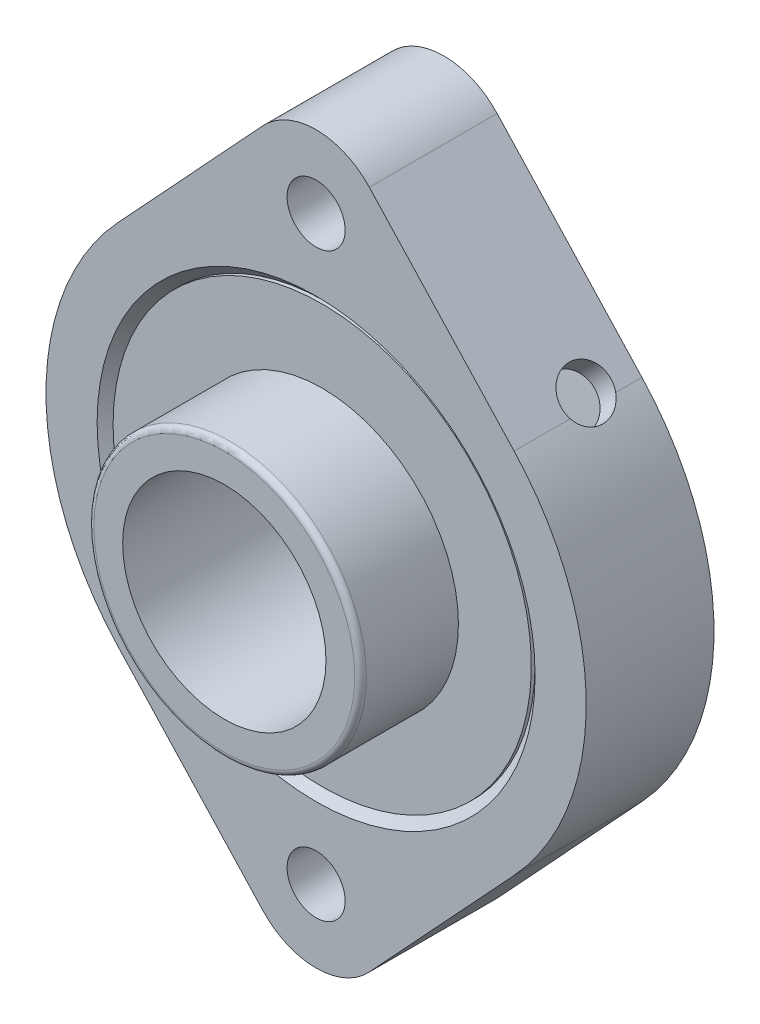
ISO-10303-21;
HEADER;
FILE_DESCRIPTION(('STEP AP214'),'2;1');
FILE_NAME('part.step','',(''),(''),'','','');
FILE_SCHEMA(('AUTOMOTIVE_DESIGN { 1 0 10303 214 1 1 1 1 }'));
ENDSEC;
DATA;
#1=APPLICATION_CONTEXT('core data for automotive mechanical design processes');
#2=APPLICATION_PROTOCOL_DEFINITION('international standard','automotive_design',2000,#1);
#3=PRODUCT_CONTEXT('',#1,'mechanical');
#4=PRODUCT('Part','Part','',(#3));
#5=PRODUCT_RELATED_PRODUCT_CATEGORY('part','',(#4));
#6=PRODUCT_DEFINITION_FORMATION('','',#4);
#7=PRODUCT_DEFINITION_CONTEXT('part definition',#1,'design');
#8=PRODUCT_DEFINITION('design','',#6,#7);
#9=PRODUCT_DEFINITION_SHAPE('','',#8);
#10=(LENGTH_UNIT() NAMED_UNIT(*) SI_UNIT(.MILLI.,.METRE.));
#11=(NAMED_UNIT(*) PLANE_ANGLE_UNIT() SI_UNIT($,.RADIAN.));
#12=(NAMED_UNIT(*) SI_UNIT($,.STERADIAN.) SOLID_ANGLE_UNIT());
#13=UNCERTAINTY_MEASURE_WITH_UNIT(LENGTH_MEASURE(1.E-05),#10,'distance_accuracy_value','');
#14=(GEOMETRIC_REPRESENTATION_CONTEXT(3) GLOBAL_UNCERTAINTY_ASSIGNED_CONTEXT((#13)) GLOBAL_UNIT_ASSIGNED_CONTEXT((#10,
#11,#12)) REPRESENTATION_CONTEXT('',''));
#15=CARTESIAN_POINT('',(0.,0.,0.));
#16=DIRECTION('',(0.,0.,1.));
#17=DIRECTION('',(1.,0.,0.));
#18=AXIS2_PLACEMENT_3D('',#15,#16,#17);
#19=CARTESIAN_POINT('',(0.,0.,0.));
#20=DIRECTION('',(0.,0.,-1.));
#21=DIRECTION('',(-1.,0.,0.));
#22=AXIS2_PLACEMENT_3D('',#19,#20,#21);
#23=CYLINDRICAL_SURFACE('',#22,36.);
#24=CARTESIAN_POINT('',(0.,0.,1.7));
#25=DIRECTION('',(0.,0.,-1.));
#26=DIRECTION('',(-1.,0.,0.));
#27=AXIS2_PLACEMENT_3D('',#24,#25,#26);
#28=CIRCLE('',#27,36.);
#29=CARTESIAN_POINT('',(-36.,0.,1.7));
#30=VERTEX_POINT('',#29);
#31=EDGE_CURVE('E172',#30,#30,#28,.T.);
#32=ORIENTED_EDGE('',*,*,#31,.T.);
#33=EDGE_LOOP('',(#32));
#34=FACE_BOUND('',#33,.T.);
#35=CARTESIAN_POINT('',(0.,0.,3.95));
#36=DIRECTION('',(0.,0.,1.));
#37=DIRECTION('',(1.,0.,0.));
#38=AXIS2_PLACEMENT_3D('',#35,#36,#37);
#39=CIRCLE('',#38,36.);
#40=CARTESIAN_POINT('',(36.,0.,3.95));
#41=VERTEX_POINT('',#40);
#42=EDGE_CURVE('E10',#41,#41,#39,.F.);
#43=ORIENTED_EDGE('',*,*,#42,.F.);
#44=EDGE_LOOP('',(#43));
#45=FACE_BOUND('',#44,.T.);
#46=ADVANCED_FACE('F15',(#34,#45),#23,.F.);
#47=CARTESIAN_POINT('',(-9.16515138991167,-58.5,22.));
#48=DIRECTION('',(-0.733212111192934,-0.68,0.));
#49=DIRECTION('',(0.68,-0.733212111192934,0.));
#50=AXIS2_PLACEMENT_3D('',#47,#48,#49);
#51=PLANE('',#50);
#52=DIRECTION('',(-0.68,0.733212111192934,0.));
#53=VECTOR('',#52,1.);
#54=CARTESIAN_POINT('',(-9.16515138991167,-58.5,0.));
#55=LINE('',#54,#53);
#56=CARTESIAN_POINT('',(-9.16515138991168,-58.5,0.));
#57=VERTEX_POINT('',#56);
#58=CARTESIAN_POINT('',(-34.0943631704714,-31.62,0.));
#59=VERTEX_POINT('',#58);
#60=EDGE_CURVE('E100',#57,#59,#55,.T.);
#61=ORIENTED_EDGE('',*,*,#60,.F.);
#62=DIRECTION('',(0.,0.,-1.));
#63=VECTOR('',#62,1.);
#64=CARTESIAN_POINT('',(-9.16515138991168,-58.5,22.));
#65=LINE('',#64,#63);
#66=CARTESIAN_POINT('',(-9.16515138991168,-58.5,22.));
#67=VERTEX_POINT('',#66);
#68=EDGE_CURVE('E38',#67,#57,#65,.T.);
#69=ORIENTED_EDGE('',*,*,#68,.F.);
#70=DIRECTION('',(-0.68,0.733212111192934,0.));
#71=VECTOR('',#70,1.);
#72=CARTESIAN_POINT('',(-9.16515138991167,-58.5,22.));
#73=LINE('',#72,#71);
#74=CARTESIAN_POINT('',(-34.0943631704714,-31.62,22.));
#75=VERTEX_POINT('',#74);
#76=EDGE_CURVE('E242',#67,#75,#73,.T.);
#77=ORIENTED_EDGE('',*,*,#76,.T.);
#78=DIRECTION('',(0.,0.,-1.));
#79=VECTOR('',#78,1.);
#80=CARTESIAN_POINT('',(-34.0943631704714,-31.62,22.));
#81=LINE('',#80,#79);
#82=EDGE_CURVE('E127',#75,#59,#81,.T.);
#83=ORIENTED_EDGE('',*,*,#82,.T.);
#84=EDGE_LOOP('',(#61,#69,#77,#83));
#85=FACE_BOUND('',#84,.T.);
#86=ADVANCED_FACE('F17',(#85),#51,.T.);
#87=CARTESIAN_POINT('',(0.,-50.,22.));
#88=DIRECTION('',(0.,0.,-1.));
#89=DIRECTION('',(-1.,0.,0.));
#90=AXIS2_PLACEMENT_3D('',#87,#88,#89);
#91=CYLINDRICAL_SURFACE('',#90,12.5);
#92=CARTESIAN_POINT('',(0.,-50.,0.));
#93=DIRECTION('',(0.,0.,1.));
#94=DIRECTION('',(1.,0.,0.));
#95=AXIS2_PLACEMENT_3D('',#92,#93,#94);
#96=CIRCLE('',#95,12.5);
#97=CARTESIAN_POINT('',(9.16515138991168,-58.5,0.));
#98=VERTEX_POINT('',#97);
#99=EDGE_CURVE('E248',#57,#98,#96,.T.);
#100=ORIENTED_EDGE('',*,*,#99,.T.);
#101=DIRECTION('',(0.,0.,-1.));
#102=VECTOR('',#101,1.);
#103=CARTESIAN_POINT('',(9.16515138991168,-58.5,22.));
#104=LINE('',#103,#102);
#105=CARTESIAN_POINT('',(9.16515138991168,-58.5,22.));
#106=VERTEX_POINT('',#105);
#107=EDGE_CURVE('E114',#106,#98,#104,.T.);
#108=ORIENTED_EDGE('',*,*,#107,.F.);
#109=CARTESIAN_POINT('',(0.,-50.,22.));
#110=DIRECTION('',(0.,0.,1.));
#111=DIRECTION('',(1.,0.,0.));
#112=AXIS2_PLACEMENT_3D('',#109,#110,#111);
#113=CIRCLE('',#112,12.5);
#114=EDGE_CURVE('E130',#67,#106,#113,.T.);
#115=ORIENTED_EDGE('',*,*,#114,.F.);
#116=ORIENTED_EDGE('',*,*,#68,.T.);
#117=EDGE_LOOP('',(#100,#108,#115,#116));
#118=FACE_BOUND('',#117,.T.);
#119=ADVANCED_FACE('F207',(#118),#91,.T.);
#120=CARTESIAN_POINT('',(9.16515138991168,-58.5,22.));
#121=DIRECTION('',(-0.733212111192935,0.68,0.));
#122=DIRECTION('',(-0.68,-0.733212111192935,0.));
#123=AXIS2_PLACEMENT_3D('',#120,#121,#122);
#124=PLANE('',#123);
#125=DIRECTION('',(0.68,0.733212111192934,0.));
#126=VECTOR('',#125,1.);
#127=CARTESIAN_POINT('',(9.16515138991168,-58.5,0.));
#128=LINE('',#127,#126);
#129=CARTESIAN_POINT('',(34.0943631704714,-31.62,0.));
#130=VERTEX_POINT('',#129);
#131=EDGE_CURVE('E256',#98,#130,#128,.T.);
#132=ORIENTED_EDGE('',*,*,#131,.T.);
#133=DIRECTION('',(0.,0.,-1.));
#134=VECTOR('',#133,1.);
#135=CARTESIAN_POINT('',(34.0943631704714,-31.62,22.));
#136=LINE('',#135,#134);
#137=CARTESIAN_POINT('',(34.0943631704714,-31.62,22.));
#138=VERTEX_POINT('',#137);
#139=EDGE_CURVE('E107',#138,#130,#136,.T.);
#140=ORIENTED_EDGE('',*,*,#139,.F.);
#141=DIRECTION('',(0.68,0.733212111192934,0.));
#142=VECTOR('',#141,1.);
#143=CARTESIAN_POINT('',(9.16515138991168,-58.5,22.));
#144=LINE('',#143,#142);
#145=EDGE_CURVE('E268',#106,#138,#144,.T.);
#146=ORIENTED_EDGE('',*,*,#145,.F.);
#147=ORIENTED_EDGE('',*,*,#107,.T.);
#148=EDGE_LOOP('',(#132,#140,#146,#147));
#149=FACE_BOUND('',#148,.T.);
#150=ADVANCED_FACE('F209',(#149),#124,.F.);
#151=CARTESIAN_POINT('',(0.,0.,22.));
#152=DIRECTION('',(0.,0.,-1.));
#153=DIRECTION('',(-1.,0.,0.));
#154=AXIS2_PLACEMENT_3D('',#151,#152,#153);
#155=CYLINDRICAL_SURFACE('',#154,46.5);
#156=DIRECTION('',(0.,0.,-1.));
#157=VECTOR('',#156,1.);
#158=CARTESIAN_POINT('',(34.0943631704714,31.62,22.));
#159=LINE('',#158,#157);
#160=CARTESIAN_POINT('',(34.0943631704714,31.62,4.52087109975289));
#161=VERTEX_POINT('',#160);
#162=CARTESIAN_POINT('',(34.0943631704714,31.62,0.));
#163=VERTEX_POINT('',#162);
#164=EDGE_CURVE('E98',#161,#163,#159,.T.);
#165=ORIENTED_EDGE('',*,*,#164,.F.);
#166=CARTESIAN_POINT('',(35.7692309983765,29.7121543107326,8.4302));
#167=CARTESIAN_POINT('',(35.7692254561079,29.7121635364158,8.67022988429306));
#168=CARTESIAN_POINT('',(35.756249114742,29.7278041995873,8.91042081029502));
#169=CARTESIAN_POINT('',(35.7045674556961,29.7898544820454,9.38415004010265));
#170=CARTESIAN_POINT('',(35.6658333872455,29.8362984838606,9.61768060549834));
#171=CARTESIAN_POINT('',(35.5634424470962,29.9582686954238,10.0711597834122));
#172=CARTESIAN_POINT('',(35.4998001981988,30.0337778415211,10.2911162772863));
#173=CARTESIAN_POINT('',(35.3489271749272,30.2112039382318,10.7113418697394));
#174=CARTESIAN_POINT('',(35.2617012627528,30.313115445339,10.9116150148058));
#175=CARTESIAN_POINT('',(35.0652272779965,30.5401763458986,11.2874608311464));
#176=CARTESIAN_POINT('',(34.9559191226329,30.6653890638803,11.4629638441586));
#177=CARTESIAN_POINT('',(34.7178297537534,30.9346816954479,11.7836883299502));
#178=CARTESIAN_POINT('',(34.5890476698315,31.0787624523205,11.9289084485157));
#179=CARTESIAN_POINT('',(34.3147388229442,31.3813704875181,12.1851816894636));
#180=CARTESIAN_POINT('',(34.1691827709278,31.5399229313651,12.2961737654083));
#181=CARTESIAN_POINT('',(33.8650819809425,31.8662188822345,12.4804497682124));
#182=CARTESIAN_POINT('',(33.7065375153133,32.0339621965192,12.5537344854816));
#183=CARTESIAN_POINT('',(33.3810558904335,32.3729847241378,12.6603128428896));
#184=CARTESIAN_POINT('',(33.2141440083465,32.5442524637337,12.6937201611715));
#185=CARTESIAN_POINT('',(32.8760920442889,32.8857154294857,12.7199469911473));
#186=CARTESIAN_POINT('',(32.7049520566661,33.0559106794677,12.712767407704));
#187=CARTESIAN_POINT('',(32.3638927614773,33.3898975738291,12.6581168538885));
#188=CARTESIAN_POINT('',(32.1939713260559,33.5537070707237,12.6107681234561));
#189=CARTESIAN_POINT('',(31.8598875599316,33.8710892717323,12.4773135872285));
#190=CARTESIAN_POINT('',(31.6957252942355,34.0246618603146,12.3912073441087));
#191=CARTESIAN_POINT('',(31.3779777318752,34.3179162798177,12.1825468970022));
#192=CARTESIAN_POINT('',(31.224408651216,34.4575769534556,12.0599382763226));
#193=CARTESIAN_POINT('',(30.9329941545703,34.7194226668504,11.7817929922067));
#194=CARTESIAN_POINT('',(30.7951491293804,34.8416072722864,11.6262555106497));
#195=CARTESIAN_POINT('',(30.5392125814562,35.0661610687445,11.2859794307008));
#196=CARTESIAN_POINT('',(30.421196303469,35.1684550010399,11.1011345533857));
#197=CARTESIAN_POINT('',(30.2095412660357,35.3504336872525,10.7078601689583));
#198=CARTESIAN_POINT('',(30.1159025337662,35.4301184159647,10.4994306355537));
#199=CARTESIAN_POINT('',(29.9562532199488,35.5652060999507,10.06482520629));
#200=CARTESIAN_POINT('',(29.8902471940019,35.620605051478,9.83864639153018));
#201=CARTESIAN_POINT('',(29.7882501402077,35.7059464985723,9.37500083147789));
#202=CARTESIAN_POINT('',(29.7522583390535,35.73588965,9.1375343771744));
#203=CARTESIAN_POINT('',(29.7116739040213,35.7696399410706,8.65898710525928));
#204=CARTESIAN_POINT('',(29.7069665455948,35.7735425752451,8.41792274636374));
#205=CARTESIAN_POINT('',(29.7288176935448,35.755385502723,7.93820347211821));
#206=CARTESIAN_POINT('',(29.7553758425265,35.7333260927975,7.69954852925774));
#207=CARTESIAN_POINT('',(29.8387179817599,35.6637605521811,7.23185266055563));
#208=CARTESIAN_POINT('',(29.8954483542485,35.6162995606092,7.00279545551552));
#209=CARTESIAN_POINT('',(30.0370801467671,35.4969342819518,6.56029199744237));
#210=CARTESIAN_POINT('',(30.1219821167365,35.4250295176971,6.34684604925689));
#211=CARTESIAN_POINT('',(30.3172872206761,35.2580287193141,5.94094517977125));
#212=CARTESIAN_POINT('',(30.4277634904814,35.1628661294879,5.74855283552523));
#213=CARTESIAN_POINT('',(30.6703243705633,34.9514951652063,5.39085400900537));
#214=CARTESIAN_POINT('',(30.8024094346317,34.8352863487677,5.2255480957016));
#215=CARTESIAN_POINT('',(31.084253347763,34.584026306798,4.92620453947198));
#216=CARTESIAN_POINT('',(31.2340648060356,34.4489187650994,4.79226367411646));
#217=CARTESIAN_POINT('',(31.5461922238308,34.1633201379182,4.56011729849237));
#218=CARTESIAN_POINT('',(31.7085080347847,34.0128292352039,4.46191136372366));
#219=CARTESIAN_POINT('',(32.0402878095187,33.7004709993624,4.30418764049512));
#220=CARTESIAN_POINT('',(32.2097404209524,33.5386214797435,4.24461070978115));
#221=CARTESIAN_POINT('',(32.5508751230014,33.2076344030564,4.16564300612893));
#222=CARTESIAN_POINT('',(32.7225571610239,33.0384970176936,4.14625128693686));
#223=CARTESIAN_POINT('',(33.0624967571763,32.6983015181016,4.14821662779184));
#224=CARTESIAN_POINT('',(33.2307646366299,32.5272528276434,4.16942316256173));
#225=CARTESIAN_POINT('',(33.5598640184205,32.1875980480688,4.25166825761926));
#226=CARTESIAN_POINT('',(33.7206955126485,32.018991961616,4.31270686134001));
#227=CARTESIAN_POINT('',(34.0306851310267,31.6893310493359,4.47284338839639));
#228=CARTESIAN_POINT('',(34.179844353012,31.5282755139143,4.57193772720945));
#229=CARTESIAN_POINT('',(34.4628189335305,31.2187146685365,4.80535627829713));
#230=CARTESIAN_POINT('',(34.5966344572458,31.0702092234774,4.93968011125898));
#231=CARTESIAN_POINT('',(34.846251027484,30.7900013844369,5.24030990170125));
#232=CARTESIAN_POINT('',(34.9619864382644,30.6583605108856,5.40672769953473));
#233=CARTESIAN_POINT('',(35.1723138513329,30.4168384075728,5.76660827998015));
#234=CARTESIAN_POINT('',(35.2669007507198,30.3069624301673,5.96007757155351));
#235=CARTESIAN_POINT('',(35.4330481122509,30.1125479211409,6.36902588271521));
#236=CARTESIAN_POINT('',(35.5045572960921,30.0280658425107,6.584552533823));
#237=CARTESIAN_POINT('',(35.6226979805273,29.8878215048551,7.03100990551552));
#238=CARTESIAN_POINT('',(35.669357811654,29.8320265424169,7.26192274490153));
#239=CARTESIAN_POINT('',(35.7251159391823,29.7652010525927,7.65017559157857));
#240=CARTESIAN_POINT('',(35.74164233762,29.7453408919306,7.80502580440075));
#241=CARTESIAN_POINT('',(35.7637016588979,29.7188145298277,8.11662776895285));
#242=CARTESIAN_POINT('',(35.7692346193475,29.7121482832492,8.27337951417562));
#243=CARTESIAN_POINT('',(35.7692309983765,29.7121543107326,8.4302));
#244=B_SPLINE_CURVE_WITH_KNOTS('',3,(#166,#167,#168,#169,#170,#171,#172,#173,#174,#175,#176,
#177,#178,#179,#180,#181,#182,#183,#184,#185,#186,#187,#188,#189,#190,#191,#192,#193,#194,#195,
#196,#197,#198,#199,#200,#201,#202,#203,#204,#205,#206,#207,#208,#209,#210,#211,#212,#213,#214,
#215,#216,#217,#218,#219,#220,#221,#222,#223,#224,#225,#226,#227,#228,#229,#230,#231,#232,#233,
#234,#235,#236,#237,#238,#239,#240,#241,#242,#243),.UNSPECIFIED.,.T.,.F.,(4,2,2,2,2,2,2,2,2,2,2,
2,2,2,2,2,2,2,2,2,2,2,2,2,2,2,2,2,2,2,2,2,2,2,2,2,2,2,4),(0.,0.71951702240366,1.43983852067846,
2.1597377738859,2.87948871983472,3.60122504471728,4.32299363784314,5.04604217329137,
5.76907555180482,6.49004282530659,7.21099402529976,7.92975911442344,8.64853231401428,
9.36838245175172,10.0882504763351,10.8107913573822,11.5333330439276,12.2559938037388,
12.9786359438535,13.6986265820805,14.4186089902052,15.137316202623,15.856037445793,
16.5768400057162,17.297657704678,18.0206710297903,18.743675765848,19.4655709279932,
20.1874490912528,20.9066559450098,21.6258635829951,22.3450034944222,23.0641356632528,
23.7858206731112,24.5076796300884,25.2311316755116,25.9537571441574,26.4238460889792,
26.8939334255813),.UNSPECIFIED.);
#245=CARTESIAN_POINT('',(34.0943631704714,31.62,12.3395289002471));
#246=VERTEX_POINT('',#245);
#247=EDGE_CURVE('E30',#161,#246,#244,.T.);
#248=ORIENTED_EDGE('',*,*,#247,.T.);
#249=CARTESIAN_POINT('',(34.0943631704714,31.62,22.));
#250=VERTEX_POINT('',#249);
#251=EDGE_CURVE('E95',#250,#246,#159,.T.);
#252=ORIENTED_EDGE('',*,*,#251,.F.);
#253=CARTESIAN_POINT('',(0.,0.,22.));
#254=DIRECTION('',(0.,0.,1.));
#255=DIRECTION('',(1.,0.,0.));
#256=AXIS2_PLACEMENT_3D('',#253,#254,#255);
#257=CIRCLE('',#256,46.5);
#258=EDGE_CURVE('E293',#138,#250,#257,.T.);
#259=ORIENTED_EDGE('',*,*,#258,.F.);
#260=ORIENTED_EDGE('',*,*,#139,.T.);
#261=CARTESIAN_POINT('',(0.,0.,0.));
#262=DIRECTION('',(0.,0.,1.));
#263=DIRECTION('',(1.,0.,0.));
#264=AXIS2_PLACEMENT_3D('',#261,#262,#263);
#265=CIRCLE('',#264,46.5);
#266=EDGE_CURVE('E274',#130,#163,#265,.T.);
#267=ORIENTED_EDGE('',*,*,#266,.T.);
#268=EDGE_LOOP('',(#165,#248,#252,#259,#260,#267));
#269=FACE_BOUND('',#268,.T.);
#270=ADVANCED_FACE('F93',(#269),#155,.T.);
#271=CARTESIAN_POINT('',(9.16515138991168,58.5,22.));
#272=DIRECTION('',(0.733212111192935,0.68,0.));
#273=DIRECTION('',(-0.68,0.733212111192935,0.));
#274=AXIS2_PLACEMENT_3D('',#271,#272,#273);
#275=PLANE('',#274);
#276=CARTESIAN_POINT('',(32.9037655647799,32.9037655647799,8.4302));
#277=DIRECTION('',(0.733212111192935,0.68,0.));
#278=DIRECTION('',(-0.68,0.733212111192935,0.));
#279=AXIS2_PLACEMENT_3D('',#276,#277,#278);
#280=ELLIPSE('',#279,4.28603508254045,4.283);
#281=EDGE_CURVE('E24',#161,#246,#280,.T.);
#282=ORIENTED_EDGE('',*,*,#281,.F.);
#283=ORIENTED_EDGE('',*,*,#164,.T.);
#284=DIRECTION('',(0.68,-0.733212111192934,0.));
#285=VECTOR('',#284,1.);
#286=CARTESIAN_POINT('',(9.16515138991168,58.5,0.));
#287=LINE('',#286,#285);
#288=CARTESIAN_POINT('',(9.16515138991169,58.5,0.));
#289=VERTEX_POINT('',#288);
#290=EDGE_CURVE('E280',#289,#163,#287,.T.);
#291=ORIENTED_EDGE('',*,*,#290,.F.);
#292=DIRECTION('',(0.,0.,-1.));
#293=VECTOR('',#292,1.);
#294=CARTESIAN_POINT('',(9.16515138991169,58.5,22.));
#295=LINE('',#294,#293);
#296=CARTESIAN_POINT('',(9.16515138991169,58.5,22.));
#297=VERTEX_POINT('',#296);
#298=EDGE_CURVE('E117',#297,#289,#295,.T.);
#299=ORIENTED_EDGE('',*,*,#298,.F.);
#300=DIRECTION('',(0.68,-0.733212111192934,0.));
#301=VECTOR('',#300,1.);
#302=CARTESIAN_POINT('',(9.16515138991168,58.5,22.));
#303=LINE('',#302,#301);
#304=EDGE_CURVE('E105',#297,#250,#303,.T.);
#305=ORIENTED_EDGE('',*,*,#304,.T.);
#306=ORIENTED_EDGE('',*,*,#251,.T.);
#307=EDGE_LOOP('',(#282,#283,#291,#299,#305,#306));
#308=FACE_BOUND('',#307,.T.);
#309=ADVANCED_FACE('F103',(#308),#275,.T.);
#310=CARTESIAN_POINT('',(0.,50.,22.));
#311=DIRECTION('',(0.,0.,-1.));
#312=DIRECTION('',(-1.,0.,0.));
#313=AXIS2_PLACEMENT_3D('',#310,#311,#312);
#314=CYLINDRICAL_SURFACE('',#313,12.5);
#315=CARTESIAN_POINT('',(0.,50.,0.));
#316=DIRECTION('',(0.,0.,1.));
#317=DIRECTION('',(1.,0.,0.));
#318=AXIS2_PLACEMENT_3D('',#315,#316,#317);
#319=CIRCLE('',#318,12.5);
#320=CARTESIAN_POINT('',(-9.16515138991167,58.5,0.));
#321=VERTEX_POINT('',#320);
#322=EDGE_CURVE('E635',#289,#321,#319,.T.);
#323=ORIENTED_EDGE('',*,*,#322,.T.);
#324=DIRECTION('',(0.,0.,-1.));
#325=VECTOR('',#324,1.);
#326=CARTESIAN_POINT('',(-9.16515138991167,58.5,22.));
#327=LINE('',#326,#325);
#328=CARTESIAN_POINT('',(-9.16515138991167,58.5,22.));
#329=VERTEX_POINT('',#328);
#330=EDGE_CURVE('E122',#329,#321,#327,.T.);
#331=ORIENTED_EDGE('',*,*,#330,.F.);
#332=CARTESIAN_POINT('',(0.,50.,22.));
#333=DIRECTION('',(0.,0.,1.));
#334=DIRECTION('',(1.,0.,0.));
#335=AXIS2_PLACEMENT_3D('',#332,#333,#334);
#336=CIRCLE('',#335,12.5);
#337=EDGE_CURVE('E288',#297,#329,#336,.T.);
#338=ORIENTED_EDGE('',*,*,#337,.F.);
#339=ORIENTED_EDGE('',*,*,#298,.T.);
#340=EDGE_LOOP('',(#323,#331,#338,#339));
#341=FACE_BOUND('',#340,.T.);
#342=ADVANCED_FACE('F328',(#341),#314,.T.);
#343=CARTESIAN_POINT('',(-9.16515138991167,58.5,22.));
#344=DIRECTION('',(0.733212111192934,-0.68,0.));
#345=DIRECTION('',(0.68,0.733212111192934,0.));
#346=AXIS2_PLACEMENT_3D('',#343,#344,#345);
#347=PLANE('',#346);
#348=DIRECTION('',(-0.68,-0.733212111192934,0.));
#349=VECTOR('',#348,1.);
#350=CARTESIAN_POINT('',(-9.16515138991167,58.5,0.));
#351=LINE('',#350,#349);
#352=CARTESIAN_POINT('',(-34.0943631704714,31.62,0.));
#353=VERTEX_POINT('',#352);
#354=EDGE_CURVE('E633',#321,#353,#351,.T.);
#355=ORIENTED_EDGE('',*,*,#354,.T.);
#356=DIRECTION('',(0.,0.,-1.));
#357=VECTOR('',#356,1.);
#358=CARTESIAN_POINT('',(-34.0943631704714,31.62,22.));
#359=LINE('',#358,#357);
#360=CARTESIAN_POINT('',(-34.0943631704714,31.62,22.));
#361=VERTEX_POINT('',#360);
#362=EDGE_CURVE('E126',#361,#353,#359,.T.);
#363=ORIENTED_EDGE('',*,*,#362,.F.);
#364=DIRECTION('',(-0.68,-0.733212111192934,0.));
#365=VECTOR('',#364,1.);
#366=CARTESIAN_POINT('',(-9.16515138991167,58.5,22.));
#367=LINE('',#366,#365);
#368=EDGE_CURVE('E253',#329,#361,#367,.T.);
#369=ORIENTED_EDGE('',*,*,#368,.F.);
#370=ORIENTED_EDGE('',*,*,#330,.T.);
#371=EDGE_LOOP('',(#355,#363,#369,#370));
#372=FACE_BOUND('',#371,.T.);
#373=ADVANCED_FACE('F337',(#372),#347,.F.);
#374=CARTESIAN_POINT('',(0.,0.,22.));
#375=DIRECTION('',(0.,0.,-1.));
#376=DIRECTION('',(-1.,0.,0.));
#377=AXIS2_PLACEMENT_3D('',#374,#375,#376);
#378=CYLINDRICAL_SURFACE('',#377,46.5);
#379=CARTESIAN_POINT('',(0.,0.,0.));
#380=DIRECTION('',(0.,0.,1.));
#381=DIRECTION('',(1.,0.,0.));
#382=AXIS2_PLACEMENT_3D('',#379,#380,#381);
#383=CIRCLE('',#382,46.5);
#384=EDGE_CURVE('E187',#353,#59,#383,.T.);
#385=ORIENTED_EDGE('',*,*,#384,.T.);
#386=ORIENTED_EDGE('',*,*,#82,.F.);
#387=CARTESIAN_POINT('',(0.,0.,22.));
#388=DIRECTION('',(0.,0.,1.));
#389=DIRECTION('',(1.,0.,0.));
#390=AXIS2_PLACEMENT_3D('',#387,#388,#389);
#391=CIRCLE('',#390,46.5);
#392=EDGE_CURVE('E245',#361,#75,#391,.T.);
#393=ORIENTED_EDGE('',*,*,#392,.F.);
#394=ORIENTED_EDGE('',*,*,#362,.T.);
#395=EDGE_LOOP('',(#385,#386,#393,#394));
#396=FACE_BOUND('',#395,.T.);
#397=ADVANCED_FACE('F205',(#396),#378,.T.);
#398=CARTESIAN_POINT('',(0.,0.,22.));
#399=DIRECTION('',(0.,0.,1.));
#400=DIRECTION('',(1.,0.,0.));
#401=AXIS2_PLACEMENT_3D('',#398,#399,#400);
#402=PLANE('',#401);
#403=CARTESIAN_POINT('',(0.,-50.,22.));
#404=DIRECTION('',(0.,0.,1.));
#405=DIRECTION('',(1.,0.,0.));
#406=AXIS2_PLACEMENT_3D('',#403,#404,#405);
#407=CIRCLE('',#406,5.);
#408=CARTESIAN_POINT('',(4.99999999999999,-50.,22.));
#409=VERTEX_POINT('',#408);
#410=EDGE_CURVE('E138',#409,#409,#407,.T.);
#411=ORIENTED_EDGE('',*,*,#410,.F.);
#412=EDGE_LOOP('',(#411));
#413=FACE_BOUND('',#412,.T.);
#414=CARTESIAN_POINT('',(0.,50.,22.));
#415=DIRECTION('',(0.,0.,1.));
#416=DIRECTION('',(1.,0.,0.));
#417=AXIS2_PLACEMENT_3D('',#414,#415,#416);
#418=CIRCLE('',#417,5.);
#419=CARTESIAN_POINT('',(5.,50.,22.));
#420=VERTEX_POINT('',#419);
#421=EDGE_CURVE('E137',#420,#420,#418,.T.);
#422=ORIENTED_EDGE('',*,*,#421,.F.);
#423=EDGE_LOOP('',(#422));
#424=FACE_BOUND('',#423,.T.);
#425=CARTESIAN_POINT('',(0.,0.,22.));
#426=DIRECTION('',(0.,0.,-1.));
#427=DIRECTION('',(-1.,0.,0.));
#428=AXIS2_PLACEMENT_3D('',#425,#426,#427);
#429=CIRCLE('',#428,37.7);
#430=CARTESIAN_POINT('',(-37.7,0.,22.));
#431=VERTEX_POINT('',#430);
#432=EDGE_CURVE('E176',#431,#431,#429,.T.);
#433=ORIENTED_EDGE('',*,*,#432,.T.);
#434=EDGE_LOOP('',(#433));
#435=FACE_BOUND('',#434,.T.);
#436=ORIENTED_EDGE('',*,*,#76,.F.);
#437=ORIENTED_EDGE('',*,*,#114,.T.);
#438=ORIENTED_EDGE('',*,*,#145,.T.);
#439=ORIENTED_EDGE('',*,*,#258,.T.);
#440=ORIENTED_EDGE('',*,*,#304,.F.);
#441=ORIENTED_EDGE('',*,*,#337,.T.);
#442=ORIENTED_EDGE('',*,*,#368,.T.);
#443=ORIENTED_EDGE('',*,*,#392,.T.);
#444=EDGE_LOOP('',(#436,#437,#438,#439,#440,#441,#442,#443));
#445=FACE_BOUND('',#444,.T.);
#446=ADVANCED_FACE('F202',(#413,#424,#435,#445),#402,.T.);
#447=CARTESIAN_POINT('',(0.,0.,0.));
#448=DIRECTION('',(0.,0.,1.));
#449=DIRECTION('',(1.,0.,0.));
#450=AXIS2_PLACEMENT_3D('',#447,#448,#449);
#451=PLANE('',#450);
#452=CARTESIAN_POINT('',(0.,-50.,0.));
#453=DIRECTION('',(0.,0.,1.));
#454=DIRECTION('',(1.,0.,0.));
#455=AXIS2_PLACEMENT_3D('',#452,#453,#454);
#456=CIRCLE('',#455,5.);
#457=CARTESIAN_POINT('',(4.99999999999999,-50.,0.));
#458=VERTEX_POINT('',#457);
#459=EDGE_CURVE('E139',#458,#458,#456,.T.);
#460=ORIENTED_EDGE('',*,*,#459,.T.);
#461=EDGE_LOOP('',(#460));
#462=FACE_BOUND('',#461,.T.);
#463=CARTESIAN_POINT('',(0.,50.,0.));
#464=DIRECTION('',(0.,0.,1.));
#465=DIRECTION('',(1.,0.,0.));
#466=AXIS2_PLACEMENT_3D('',#463,#464,#465);
#467=CIRCLE('',#466,5.);
#468=CARTESIAN_POINT('',(5.,50.,0.));
#469=VERTEX_POINT('',#468);
#470=EDGE_CURVE('E134',#469,#469,#467,.T.);
#471=ORIENTED_EDGE('',*,*,#470,.T.);
#472=EDGE_LOOP('',(#471));
#473=FACE_BOUND('',#472,.T.);
#474=CARTESIAN_POINT('',(0.,0.,0.));
#475=DIRECTION('',(0.,0.,-1.));
#476=DIRECTION('',(-1.,0.,0.));
#477=AXIS2_PLACEMENT_3D('',#474,#475,#476);
#478=CIRCLE('',#477,37.7);
#479=CARTESIAN_POINT('',(-37.7,0.,0.));
#480=VERTEX_POINT('',#479);
#481=EDGE_CURVE('E168',#480,#480,#478,.T.);
#482=ORIENTED_EDGE('',*,*,#481,.F.);
#483=EDGE_LOOP('',(#482));
#484=FACE_BOUND('',#483,.T.);
#485=ORIENTED_EDGE('',*,*,#60,.T.);
#486=ORIENTED_EDGE('',*,*,#384,.F.);
#487=ORIENTED_EDGE('',*,*,#354,.F.);
#488=ORIENTED_EDGE('',*,*,#322,.F.);
#489=ORIENTED_EDGE('',*,*,#290,.T.);
#490=ORIENTED_EDGE('',*,*,#266,.F.);
#491=ORIENTED_EDGE('',*,*,#131,.F.);
#492=ORIENTED_EDGE('',*,*,#99,.F.);
#493=EDGE_LOOP('',(#485,#486,#487,#488,#489,#490,#491,#492));
#494=FACE_BOUND('',#493,.T.);
#495=ADVANCED_FACE('F197',(#462,#473,#484,#494),#451,.F.);
#496=CARTESIAN_POINT('',(30.0753384400338,30.0753384400338,8.4302));
#497=DIRECTION('',(0.707106781186548,0.707106781186548,0.));
#498=DIRECTION('',(0.707106781186548,-0.707106781186548,0.));
#499=AXIS2_PLACEMENT_3D('',#496,#497,#498);
#500=CYLINDRICAL_SURFACE('',#499,4.283);
#501=CARTESIAN_POINT('',(30.0753384400338,30.0753384400338,8.4302));
#502=DIRECTION('',(0.707106781186548,0.707106781186548,0.));
#503=DIRECTION('',(0.707106781186548,-0.707106781186548,0.));
#504=AXIS2_PLACEMENT_3D('',#501,#502,#503);
#505=CIRCLE('',#504,4.283);
#506=CARTESIAN_POINT('',(33.1038767838557,27.0468000962118,8.4302));
#507=VERTEX_POINT('',#506);
#508=EDGE_CURVE('E101',#507,#507,#505,.T.);
#509=ORIENTED_EDGE('',*,*,#508,.F.);
#510=EDGE_LOOP('',(#509));
#511=FACE_BOUND('',#510,.T.);
#512=ORIENTED_EDGE('',*,*,#281,.T.);
#513=ORIENTED_EDGE('',*,*,#247,.F.);
#514=EDGE_LOOP('',(#512,#513));
#515=FACE_BOUND('',#514,.T.);
#516=ADVANCED_FACE('F85',(#511,#515),#500,.F.);
#517=CARTESIAN_POINT('',(30.0753384400338,30.0753384400338,8.4302));
#518=DIRECTION('',(-0.707106781186548,-0.707106781186548,0.));
#519=DIRECTION('',(0.,0.,-1.));
#520=AXIS2_PLACEMENT_3D('',#517,#518,#519);
#521=PLANE('',#520);
#522=ORIENTED_EDGE('',*,*,#508,.T.);
#523=EDGE_LOOP('',(#522));
#524=FACE_BOUND('',#523,.T.);
#525=ADVANCED_FACE('F196',(#524),#521,.F.);
#526=CARTESIAN_POINT('',(0.,0.,20.3));
#527=DIRECTION('',(0.,0.,1.));
#528=DIRECTION('',(1.,0.,0.));
#529=AXIS2_PLACEMENT_3D('',#526,#527,#528);
#530=CONICAL_SURFACE('',#529,36.,0.78539816339745);
#531=ORIENTED_EDGE('',*,*,#432,.F.);
#532=EDGE_LOOP('',(#531));
#533=FACE_BOUND('',#532,.T.);
#534=CARTESIAN_POINT('',(0.,0.,20.3));
#535=DIRECTION('',(0.,0.,1.));
#536=DIRECTION('',(1.,0.,0.));
#537=AXIS2_PLACEMENT_3D('',#534,#535,#536);
#538=CIRCLE('',#537,36.);
#539=CARTESIAN_POINT('',(36.,0.,20.3));
#540=VERTEX_POINT('',#539);
#541=EDGE_CURVE('E142',#540,#540,#538,.T.);
#542=ORIENTED_EDGE('',*,*,#541,.F.);
#543=EDGE_LOOP('',(#542));
#544=FACE_BOUND('',#543,.T.);
#545=ADVANCED_FACE('F227',(#533,#544),#530,.F.);
#546=CARTESIAN_POINT('',(0.,0.,0.));
#547=DIRECTION('',(0.,0.,-1.));
#548=DIRECTION('',(-1.,0.,0.));
#549=AXIS2_PLACEMENT_3D('',#546,#547,#548);
#550=CONICAL_SURFACE('',#549,37.7,0.785398163397449);
#551=ORIENTED_EDGE('',*,*,#31,.F.);
#552=EDGE_LOOP('',(#551));
#553=FACE_BOUND('',#552,.T.);
#554=ORIENTED_EDGE('',*,*,#481,.T.);
#555=EDGE_LOOP('',(#554));
#556=FACE_BOUND('',#555,.T.);
#557=ADVANCED_FACE('F225',(#553,#556),#550,.F.);
#558=CARTESIAN_POINT('',(0.,50.,-1.));
#559=DIRECTION('',(0.,0.,1.));
#560=DIRECTION('',(0.,1.,0.));
#561=AXIS2_PLACEMENT_3D('',#558,#559,#560);
#562=CYLINDRICAL_SURFACE('',#561,5.);
#563=ORIENTED_EDGE('',*,*,#421,.T.);
#564=EDGE_LOOP('',(#563));
#565=FACE_BOUND('',#564,.T.);
#566=ORIENTED_EDGE('',*,*,#470,.F.);
#567=EDGE_LOOP('',(#566));
#568=FACE_BOUND('',#567,.T.);
#569=ADVANCED_FACE('F234',(#565,#568),#562,.F.);
#570=CARTESIAN_POINT('',(0.,-50.,-1.));
#571=DIRECTION('',(0.,0.,1.));
#572=DIRECTION('',(0.,-1.,0.));
#573=AXIS2_PLACEMENT_3D('',#570,#571,#572);
#574=CYLINDRICAL_SURFACE('',#573,5.);
#575=ORIENTED_EDGE('',*,*,#410,.T.);
#576=EDGE_LOOP('',(#575));
#577=FACE_BOUND('',#576,.T.);
#578=ORIENTED_EDGE('',*,*,#459,.F.);
#579=EDGE_LOOP('',(#578));
#580=FACE_BOUND('',#579,.T.);
#581=ADVANCED_FACE('F408',(#577,#580),#574,.F.);
#582=CARTESIAN_POINT('',(0.,0.,-5.08));
#583=DIRECTION('',(0.,0.,-1.));
#584=DIRECTION('',(-1.,0.,0.));
#585=AXIS2_PLACEMENT_3D('',#582,#583,#584);
#586=CYLINDRICAL_SURFACE('',#585,36.);
#587=CARTESIAN_POINT('',(0.,0.,20.95));
#588=DIRECTION('',(0.,0.,-1.));
#589=DIRECTION('',(-1.,0.,0.));
#590=AXIS2_PLACEMENT_3D('',#587,#588,#589);
#591=CIRCLE('',#590,36.);
#592=CARTESIAN_POINT('',(-36.,0.,20.95));
#593=VERTEX_POINT('',#592);
#594=EDGE_CURVE('E564',#593,#593,#591,.T.);
#595=ORIENTED_EDGE('',*,*,#594,.T.);
#596=EDGE_LOOP('',(#595));
#597=FACE_BOUND('',#596,.T.);
#598=ORIENTED_EDGE('',*,*,#541,.T.);
#599=EDGE_LOOP('',(#598));
#600=FACE_BOUND('',#599,.T.);
#601=ADVANCED_FACE('F418',(#597,#600),#586,.T.);
#602=CARTESIAN_POINT('',(0.,22.45,-5.08));
#603=DIRECTION('',(0.,0.,1.));
#604=DIRECTION('',(1.,0.,0.));
#605=AXIS2_PLACEMENT_3D('',#602,#603,#604);
#606=PLANE('',#605);
#607=CARTESIAN_POINT('',(0.,0.,-5.08));
#608=DIRECTION('',(0.,0.,-1.));
#609=DIRECTION('',(-1.,0.,0.));
#610=AXIS2_PLACEMENT_3D('',#607,#608,#609);
#611=CIRCLE('',#610,17.5);
#612=CARTESIAN_POINT('',(-17.5,0.,-5.08));
#613=VERTEX_POINT('',#612);
#614=EDGE_CURVE('E152',#613,#613,#611,.T.);
#615=ORIENTED_EDGE('',*,*,#614,.F.);
#616=EDGE_LOOP('',(#615));
#617=FACE_BOUND('',#616,.T.);
#618=CARTESIAN_POINT('',(0.,0.,-5.08));
#619=DIRECTION('',(0.,0.,-1.));
#620=DIRECTION('',(-1.,0.,0.));
#621=AXIS2_PLACEMENT_3D('',#618,#619,#620);
#622=CIRCLE('',#621,22.45);
#623=CARTESIAN_POINT('',(-22.45,0.,-5.08));
#624=VERTEX_POINT('',#623);
#625=EDGE_CURVE('E559',#624,#624,#622,.T.);
#626=ORIENTED_EDGE('',*,*,#625,.T.);
#627=EDGE_LOOP('',(#626));
#628=FACE_BOUND('',#627,.T.);
#629=ADVANCED_FACE('F429',(#617,#628),#606,.F.);
#630=CARTESIAN_POINT('',(0.,0.,-5.08));
#631=DIRECTION('',(0.,0.,-1.));
#632=DIRECTION('',(-1.,0.,0.));
#633=AXIS2_PLACEMENT_3D('',#630,#631,#632);
#634=CYLINDRICAL_SURFACE('',#633,17.5);
#635=CARTESIAN_POINT('',(0.,0.,37.8));
#636=DIRECTION('',(0.,0.,-1.));
#637=DIRECTION('',(-1.,0.,0.));
#638=AXIS2_PLACEMENT_3D('',#635,#636,#637);
#639=CIRCLE('',#638,17.5);
#640=CARTESIAN_POINT('',(-17.5,0.,37.8));
#641=VERTEX_POINT('',#640);
#642=EDGE_CURVE('E161',#641,#641,#639,.T.);
#643=ORIENTED_EDGE('',*,*,#642,.F.);
#644=EDGE_LOOP('',(#643));
#645=FACE_BOUND('',#644,.T.);
#646=ORIENTED_EDGE('',*,*,#614,.T.);
#647=EDGE_LOOP('',(#646));
#648=FACE_BOUND('',#647,.T.);
#649=ADVANCED_FACE('F441',(#645,#648),#634,.F.);
#650=CARTESIAN_POINT('',(0.,17.5,37.8));
#651=DIRECTION('',(0.,0.,-1.));
#652=DIRECTION('',(-1.,0.,0.));
#653=AXIS2_PLACEMENT_3D('',#650,#651,#652);
#654=PLANE('',#653);
#655=CARTESIAN_POINT('',(0.,0.,37.8));
#656=DIRECTION('',(0.,0.,-1.));
#657=DIRECTION('',(-1.,0.,0.));
#658=AXIS2_PLACEMENT_3D('',#655,#656,#657);
#659=CIRCLE('',#658,22.45);
#660=CARTESIAN_POINT('',(-22.45,0.,37.8));
#661=VERTEX_POINT('',#660);
#662=EDGE_CURVE('E577',#661,#661,#659,.T.);
#663=ORIENTED_EDGE('',*,*,#662,.F.);
#664=EDGE_LOOP('',(#663));
#665=FACE_BOUND('',#664,.T.);
#666=ORIENTED_EDGE('',*,*,#642,.T.);
#667=EDGE_LOOP('',(#666));
#668=FACE_BOUND('',#667,.T.);
#669=ADVANCED_FACE('F452',(#665,#668),#654,.F.);
#670=CARTESIAN_POINT('',(0.,0.,36.8));
#671=DIRECTION('',(0.,0.,-1.));
#672=DIRECTION('',(-1.,0.,0.));
#673=AXIS2_PLACEMENT_3D('',#670,#671,#672);
#674=TOROIDAL_SURFACE('',#673,22.45,1.);
#675=CARTESIAN_POINT('',(0.,0.,36.8));
#676=DIRECTION('',(0.,0.,-1.));
#677=DIRECTION('',(-1.,0.,0.));
#678=AXIS2_PLACEMENT_3D('',#675,#676,#677);
#679=CIRCLE('',#678,23.45);
#680=CARTESIAN_POINT('',(-23.45,0.,36.8));
#681=VERTEX_POINT('',#680);
#682=EDGE_CURVE('E574',#681,#681,#679,.T.);
#683=ORIENTED_EDGE('',*,*,#682,.F.);
#684=EDGE_LOOP('',(#683));
#685=FACE_BOUND('',#684,.T.);
#686=ORIENTED_EDGE('',*,*,#662,.T.);
#687=EDGE_LOOP('',(#686));
#688=FACE_BOUND('',#687,.T.);
#689=ADVANCED_FACE('F465',(#685,#688),#674,.T.);
#690=CARTESIAN_POINT('',(0.,0.,-5.08));
#691=DIRECTION('',(0.,0.,-1.));
#692=DIRECTION('',(-1.,0.,0.));
#693=AXIS2_PLACEMENT_3D('',#690,#691,#692);
#694=CYLINDRICAL_SURFACE('',#693,23.45);
#695=CARTESIAN_POINT('',(0.,0.,20.95));
#696=DIRECTION('',(0.,0.,-1.));
#697=DIRECTION('',(-1.,0.,0.));
#698=AXIS2_PLACEMENT_3D('',#695,#696,#697);
#699=CIRCLE('',#698,23.45);
#700=CARTESIAN_POINT('',(-23.45,0.,20.95));
#701=VERTEX_POINT('',#700);
#702=EDGE_CURVE('E571',#701,#701,#699,.T.);
#703=ORIENTED_EDGE('',*,*,#702,.F.);
#704=EDGE_LOOP('',(#703));
#705=FACE_BOUND('',#704,.T.);
#706=ORIENTED_EDGE('',*,*,#682,.T.);
#707=EDGE_LOOP('',(#706));
#708=FACE_BOUND('',#707,.T.);
#709=ADVANCED_FACE('F477',(#705,#708),#694,.T.);
#710=CARTESIAN_POINT('',(0.,23.45,20.95));
#711=DIRECTION('',(0.,0.,-1.));
#712=DIRECTION('',(-1.,0.,0.));
#713=AXIS2_PLACEMENT_3D('',#710,#711,#712);
#714=PLANE('',#713);
#715=ORIENTED_EDGE('',*,*,#594,.F.);
#716=EDGE_LOOP('',(#715));
#717=FACE_BOUND('',#716,.T.);
#718=ORIENTED_EDGE('',*,*,#702,.T.);
#719=EDGE_LOOP('',(#718));
#720=FACE_BOUND('',#719,.T.);
#721=ADVANCED_FACE('F489',(#717,#720),#714,.F.);
#722=CARTESIAN_POINT('',(0.,36.,3.95));
#723=DIRECTION('',(0.,0.,1.));
#724=DIRECTION('',(1.,0.,0.));
#725=AXIS2_PLACEMENT_3D('',#722,#723,#724);
#726=PLANE('',#725);
#727=CARTESIAN_POINT('',(0.,0.,3.95));
#728=DIRECTION('',(0.,0.,-1.));
#729=DIRECTION('',(-1.,0.,0.));
#730=AXIS2_PLACEMENT_3D('',#727,#728,#729);
#731=CIRCLE('',#730,23.45);
#732=CARTESIAN_POINT('',(-23.45,0.,3.95));
#733=VERTEX_POINT('',#732);
#734=EDGE_CURVE('E558',#733,#733,#731,.T.);
#735=ORIENTED_EDGE('',*,*,#734,.F.);
#736=EDGE_LOOP('',(#735));
#737=FACE_BOUND('',#736,.T.);
#738=ORIENTED_EDGE('',*,*,#42,.T.);
#739=EDGE_LOOP('',(#738));
#740=FACE_BOUND('',#739,.T.);
#741=ADVANCED_FACE('F501',(#737,#740),#726,.F.);
#742=CARTESIAN_POINT('',(0.,0.,-5.08));
#743=DIRECTION('',(0.,0.,-1.));
#744=DIRECTION('',(-1.,0.,0.));
#745=AXIS2_PLACEMENT_3D('',#742,#743,#744);
#746=CYLINDRICAL_SURFACE('',#745,23.45);
#747=CARTESIAN_POINT('',(0.,0.,-4.08));
#748=DIRECTION('',(0.,0.,-1.));
#749=DIRECTION('',(-1.,0.,0.));
#750=AXIS2_PLACEMENT_3D('',#747,#748,#749);
#751=CIRCLE('',#750,23.45);
#752=CARTESIAN_POINT('',(-23.45,0.,-4.08));
#753=VERTEX_POINT('',#752);
#754=EDGE_CURVE('E555',#753,#753,#751,.T.);
#755=ORIENTED_EDGE('',*,*,#754,.F.);
#756=EDGE_LOOP('',(#755));
#757=FACE_BOUND('',#756,.T.);
#758=ORIENTED_EDGE('',*,*,#734,.T.);
#759=EDGE_LOOP('',(#758));
#760=FACE_BOUND('',#759,.T.);
#761=ADVANCED_FACE('F512',(#757,#760),#746,.T.);
#762=CARTESIAN_POINT('',(0.,0.,-4.08));
#763=DIRECTION('',(0.,0.,-1.));
#764=DIRECTION('',(-1.,0.,0.));
#765=AXIS2_PLACEMENT_3D('',#762,#763,#764);
#766=TOROIDAL_SURFACE('',#765,22.45,1.);
#767=ORIENTED_EDGE('',*,*,#625,.F.);
#768=EDGE_LOOP('',(#767));
#769=FACE_BOUND('',#768,.T.);
#770=ORIENTED_EDGE('',*,*,#754,.T.);
#771=EDGE_LOOP('',(#770));
#772=FACE_BOUND('',#771,.T.);
#773=ADVANCED_FACE('F524',(#769,#772),#766,.T.);
#774=CLOSED_SHELL('',(#46,#86,#119,#150,#270,#309,#342,#373,#397,#446,#495,#516,#525,#545,#557,
#569,#581,#601,#629,#649,#669,#689,#709,#721,#741,#761,#773));
#775=MANIFOLD_SOLID_BREP('B1',#774);
#776=ADVANCED_BREP_SHAPE_REPRESENTATION('',(#18,#775),#14);
#777=SHAPE_DEFINITION_REPRESENTATION(#9,#776);
ENDSEC;
END-ISO-10303-21;
